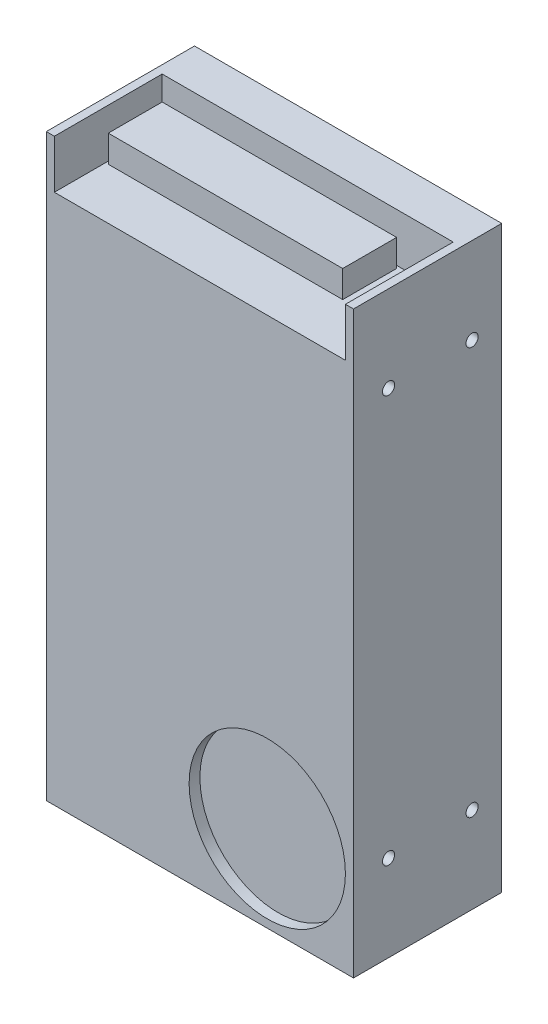
ISO-10303-21;
HEADER;
FILE_DESCRIPTION(('STEP AP214'),'2;1');
FILE_NAME('part.step','',(''),(''),'','','');
FILE_SCHEMA(('AUTOMOTIVE_DESIGN { 1 0 10303 214 1 1 1 1 }'));
ENDSEC;
DATA;
#1=APPLICATION_CONTEXT('core data for automotive mechanical design processes');
#2=APPLICATION_PROTOCOL_DEFINITION('international standard','automotive_design',2000,#1);
#3=PRODUCT_CONTEXT('',#1,'mechanical');
#4=PRODUCT('Part','Part','',(#3));
#5=PRODUCT_RELATED_PRODUCT_CATEGORY('part','',(#4));
#6=PRODUCT_DEFINITION_FORMATION('','',#4);
#7=PRODUCT_DEFINITION_CONTEXT('part definition',#1,'design');
#8=PRODUCT_DEFINITION('design','',#6,#7);
#9=PRODUCT_DEFINITION_SHAPE('','',#8);
#10=(LENGTH_UNIT() NAMED_UNIT(*) SI_UNIT(.MILLI.,.METRE.));
#11=(NAMED_UNIT(*) PLANE_ANGLE_UNIT() SI_UNIT($,.RADIAN.));
#12=(NAMED_UNIT(*) SI_UNIT($,.STERADIAN.) SOLID_ANGLE_UNIT());
#13=UNCERTAINTY_MEASURE_WITH_UNIT(LENGTH_MEASURE(1.E-05),#10,'distance_accuracy_value','');
#14=(GEOMETRIC_REPRESENTATION_CONTEXT(3) GLOBAL_UNCERTAINTY_ASSIGNED_CONTEXT((#13)) GLOBAL_UNIT_ASSIGNED_CONTEXT((#10,
#11,#12)) REPRESENTATION_CONTEXT('',''));
#15=CARTESIAN_POINT('',(0.,0.,0.));
#16=DIRECTION('',(0.,0.,1.));
#17=DIRECTION('',(1.,0.,0.));
#18=AXIS2_PLACEMENT_3D('',#15,#16,#17);
#19=CARTESIAN_POINT('',(-25.0000000000015,-75.5,15.));
#20=DIRECTION('',(0.,0.,-1.));
#21=DIRECTION('',(-1.,0.,0.));
#22=AXIS2_PLACEMENT_3D('',#19,#20,#21);
#23=CYLINDRICAL_SURFACE('',#22,2.25);
#24=CARTESIAN_POINT('',(-25.0000000000015,-75.5,0.));
#25=DIRECTION('',(0.,0.,-1.));
#26=DIRECTION('',(-1.,0.,0.));
#27=AXIS2_PLACEMENT_3D('',#24,#25,#26);
#28=CIRCLE('',#27,2.25);
#29=CARTESIAN_POINT('',(-27.2500000000015,-75.5,0.));
#30=VERTEX_POINT('',#29);
#31=EDGE_CURVE('E283',#30,#30,#28,.T.);
#32=ORIENTED_EDGE('',*,*,#31,.T.);
#33=EDGE_LOOP('',(#32));
#34=FACE_BOUND('',#33,.T.);
#35=CARTESIAN_POINT('',(-25.0000000000015,-75.5,11.0000000000016));
#36=DIRECTION('',(0.707106781186547,0.,-0.707106781186547));
#37=DIRECTION('',(-0.707106781186547,0.,-0.707106781186547));
#38=AXIS2_PLACEMENT_3D('',#35,#36,#37);
#39=ELLIPSE('',#38,3.18198051533947,2.25);
#40=CARTESIAN_POINT('',(-25.0000000000015,-73.25,11.0000000000016));
#41=VERTEX_POINT('',#40);
#42=CARTESIAN_POINT('',(-25.0000000000015,-77.75,11.0000000000016));
#43=VERTEX_POINT('',#42);
#44=EDGE_CURVE('E46',#41,#43,#39,.F.);
#45=ORIENTED_EDGE('',*,*,#44,.T.);
#46=CARTESIAN_POINT('',(-25.0000000000015,-75.5,11.0000000000016));
#47=DIRECTION('',(-0.707106781186547,0.,-0.707106781186547));
#48=DIRECTION('',(0.707106781186547,0.,-0.707106781186547));
#49=AXIS2_PLACEMENT_3D('',#46,#47,#48);
#50=ELLIPSE('',#49,3.18198051533947,2.25);
#51=EDGE_CURVE('E321',#43,#41,#50,.F.);
#52=ORIENTED_EDGE('',*,*,#51,.T.);
#53=EDGE_LOOP('',(#45,#52));
#54=FACE_BOUND('',#53,.T.);
#55=ADVANCED_FACE('F32',(#34,#54),#23,.F.);
#56=CARTESIAN_POINT('',(24.9999999999985,-75.5,15.));
#57=DIRECTION('',(0.,0.,-1.));
#58=DIRECTION('',(-1.,0.,0.));
#59=AXIS2_PLACEMENT_3D('',#56,#57,#58);
#60=CYLINDRICAL_SURFACE('',#59,2.25);
#61=CARTESIAN_POINT('',(24.9999999999985,-75.5,0.));
#62=DIRECTION('',(0.,0.,-1.));
#63=DIRECTION('',(-1.,0.,0.));
#64=AXIS2_PLACEMENT_3D('',#61,#62,#63);
#65=CIRCLE('',#64,2.25);
#66=CARTESIAN_POINT('',(22.7499999999985,-75.5,0.));
#67=VERTEX_POINT('',#66);
#68=EDGE_CURVE('E289',#67,#67,#65,.T.);
#69=ORIENTED_EDGE('',*,*,#68,.T.);
#70=EDGE_LOOP('',(#69));
#71=FACE_BOUND('',#70,.T.);
#72=CARTESIAN_POINT('',(24.9999999999985,-75.5,11.0000000000016));
#73=DIRECTION('',(0.707106781186547,0.,-0.707106781186547));
#74=DIRECTION('',(-0.707106781186547,0.,-0.707106781186547));
#75=AXIS2_PLACEMENT_3D('',#72,#73,#74);
#76=ELLIPSE('',#75,3.18198051533947,2.25);
#77=CARTESIAN_POINT('',(24.9999999999985,-73.25,11.0000000000016));
#78=VERTEX_POINT('',#77);
#79=CARTESIAN_POINT('',(24.9999999999985,-77.75,11.0000000000016));
#80=VERTEX_POINT('',#79);
#81=EDGE_CURVE('E52',#78,#80,#76,.F.);
#82=ORIENTED_EDGE('',*,*,#81,.T.);
#83=CARTESIAN_POINT('',(24.9999999999985,-75.5,11.0000000000016));
#84=DIRECTION('',(-0.707106781186547,0.,-0.707106781186547));
#85=DIRECTION('',(0.707106781186547,0.,-0.707106781186547));
#86=AXIS2_PLACEMENT_3D('',#83,#84,#85);
#87=ELLIPSE('',#86,3.18198051533947,2.25);
#88=EDGE_CURVE('E11',#80,#78,#87,.F.);
#89=ORIENTED_EDGE('',*,*,#88,.T.);
#90=EDGE_LOOP('',(#82,#89));
#91=FACE_BOUND('',#90,.T.);
#92=ADVANCED_FACE('F156',(#71,#91),#60,.F.);
#93=CARTESIAN_POINT('',(25.,75.5,15.));
#94=DIRECTION('',(0.,0.,-1.));
#95=DIRECTION('',(-1.,0.,0.));
#96=AXIS2_PLACEMENT_3D('',#93,#94,#95);
#97=CYLINDRICAL_SURFACE('',#96,2.25);
#98=CARTESIAN_POINT('',(25.,75.5,0.));
#99=DIRECTION('',(0.,0.,-1.));
#100=DIRECTION('',(-1.,0.,0.));
#101=AXIS2_PLACEMENT_3D('',#98,#99,#100);
#102=CIRCLE('',#101,2.25);
#103=CARTESIAN_POINT('',(22.75,75.5,0.));
#104=VERTEX_POINT('',#103);
#105=EDGE_CURVE('E271',#104,#104,#102,.T.);
#106=ORIENTED_EDGE('',*,*,#105,.T.);
#107=EDGE_LOOP('',(#106));
#108=FACE_BOUND('',#107,.T.);
#109=CARTESIAN_POINT('',(25.,75.5,11.));
#110=DIRECTION('',(0.707106781186547,0.,-0.707106781186547));
#111=DIRECTION('',(-0.707106781186547,0.,-0.707106781186547));
#112=AXIS2_PLACEMENT_3D('',#109,#110,#111);
#113=ELLIPSE('',#112,3.18198051533947,2.25);
#114=CARTESIAN_POINT('',(25.,77.75,11.));
#115=VERTEX_POINT('',#114);
#116=CARTESIAN_POINT('',(25.,73.25,11.));
#117=VERTEX_POINT('',#116);
#118=EDGE_CURVE('E303',#115,#117,#113,.F.);
#119=ORIENTED_EDGE('',*,*,#118,.T.);
#120=CARTESIAN_POINT('',(25.,75.5,11.));
#121=DIRECTION('',(-0.707106781186547,0.,-0.707106781186547));
#122=DIRECTION('',(0.707106781186547,0.,-0.707106781186547));
#123=AXIS2_PLACEMENT_3D('',#120,#121,#122);
#124=ELLIPSE('',#123,3.18198051533947,2.25);
#125=EDGE_CURVE('E292',#117,#115,#124,.F.);
#126=ORIENTED_EDGE('',*,*,#125,.T.);
#127=EDGE_LOOP('',(#119,#126));
#128=FACE_BOUND('',#127,.T.);
#129=ADVANCED_FACE('F362',(#108,#128),#97,.F.);
#130=CARTESIAN_POINT('',(-25.,75.5,15.));
#131=DIRECTION('',(0.,0.,-1.));
#132=DIRECTION('',(-1.,0.,0.));
#133=AXIS2_PLACEMENT_3D('',#130,#131,#132);
#134=CYLINDRICAL_SURFACE('',#133,2.25);
#135=CARTESIAN_POINT('',(-25.,75.5,0.));
#136=DIRECTION('',(0.,0.,-1.));
#137=DIRECTION('',(-1.,0.,0.));
#138=AXIS2_PLACEMENT_3D('',#135,#136,#137);
#139=CIRCLE('',#138,2.25);
#140=CARTESIAN_POINT('',(-27.25,75.5,0.));
#141=VERTEX_POINT('',#140);
#142=EDGE_CURVE('E277',#141,#141,#139,.T.);
#143=ORIENTED_EDGE('',*,*,#142,.T.);
#144=EDGE_LOOP('',(#143));
#145=FACE_BOUND('',#144,.T.);
#146=CARTESIAN_POINT('',(-25.,75.5,11.));
#147=DIRECTION('',(0.707106781186547,0.,-0.707106781186547));
#148=DIRECTION('',(-0.707106781186547,0.,-0.707106781186547));
#149=AXIS2_PLACEMENT_3D('',#146,#147,#148);
#150=ELLIPSE('',#149,3.18198051533947,2.25);
#151=CARTESIAN_POINT('',(-25.,77.75,11.));
#152=VERTEX_POINT('',#151);
#153=CARTESIAN_POINT('',(-25.,73.25,11.));
#154=VERTEX_POINT('',#153);
#155=EDGE_CURVE('E168',#152,#154,#150,.F.);
#156=ORIENTED_EDGE('',*,*,#155,.T.);
#157=CARTESIAN_POINT('',(-25.,75.5,11.));
#158=DIRECTION('',(-0.707106781186547,0.,-0.707106781186547));
#159=DIRECTION('',(0.707106781186547,0.,-0.707106781186547));
#160=AXIS2_PLACEMENT_3D('',#157,#158,#159);
#161=ELLIPSE('',#160,3.18198051533947,2.25);
#162=EDGE_CURVE('E154',#154,#152,#161,.F.);
#163=ORIENTED_EDGE('',*,*,#162,.T.);
#164=EDGE_LOOP('',(#156,#163));
#165=FACE_BOUND('',#164,.T.);
#166=ADVANCED_FACE('F467',(#145,#165),#134,.F.);
#167=CARTESIAN_POINT('',(-54.,89.5,15.));
#168=DIRECTION('',(0.,-1.,0.));
#169=DIRECTION('',(0.,0.,-1.));
#170=AXIS2_PLACEMENT_3D('',#167,#168,#169);
#171=PLANE('',#170);
#172=DIRECTION('',(1.,0.,0.));
#173=VECTOR('',#172,1.);
#174=CARTESIAN_POINT('',(-54.,89.5,55.));
#175=LINE('',#174,#173);
#176=CARTESIAN_POINT('',(-54.,89.5,55.));
#177=VERTEX_POINT('',#176);
#178=CARTESIAN_POINT('',(54.,89.5,55.));
#179=VERTEX_POINT('',#178);
#180=EDGE_CURVE('E216',#177,#179,#175,.T.);
#181=ORIENTED_EDGE('',*,*,#180,.T.);
#182=DIRECTION('',(0.,0.,1.));
#183=VECTOR('',#182,1.);
#184=CARTESIAN_POINT('',(54.,89.5,15.));
#185=LINE('',#184,#183);
#186=CARTESIAN_POINT('',(54.,89.5,15.));
#187=VERTEX_POINT('',#186);
#188=EDGE_CURVE('E206',#187,#179,#185,.T.);
#189=ORIENTED_EDGE('',*,*,#188,.F.);
#190=DIRECTION('',(1.,0.,0.));
#191=VECTOR('',#190,1.);
#192=CARTESIAN_POINT('',(-54.,89.5,15.));
#193=LINE('',#192,#191);
#194=CARTESIAN_POINT('',(-54.,89.5,15.));
#195=VERTEX_POINT('',#194);
#196=EDGE_CURVE('E227',#195,#187,#193,.T.);
#197=ORIENTED_EDGE('',*,*,#196,.F.);
#198=DIRECTION('',(0.,0.,1.));
#199=VECTOR('',#198,1.);
#200=CARTESIAN_POINT('',(-54.,89.5,15.));
#201=LINE('',#200,#199);
#202=EDGE_CURVE('E203',#195,#177,#201,.T.);
#203=ORIENTED_EDGE('',*,*,#202,.T.);
#204=EDGE_LOOP('',(#181,#189,#197,#203));
#205=FACE_BOUND('',#204,.T.);
#206=DIRECTION('',(0.,0.,1.));
#207=VECTOR('',#206,1.);
#208=CARTESIAN_POINT('',(-53.,89.5,16.));
#209=LINE('',#208,#207);
#210=CARTESIAN_POINT('',(-53.,89.5,16.));
#211=VERTEX_POINT('',#210);
#212=CARTESIAN_POINT('',(-53.,89.5,36.));
#213=VERTEX_POINT('',#212);
#214=EDGE_CURVE('E254',#211,#213,#209,.T.);
#215=ORIENTED_EDGE('',*,*,#214,.F.);
#216=DIRECTION('',(-1.,0.,0.));
#217=VECTOR('',#216,1.);
#218=CARTESIAN_POINT('',(-53.,89.5,16.));
#219=LINE('',#218,#217);
#220=CARTESIAN_POINT('',(34.,89.5,16.));
#221=VERTEX_POINT('',#220);
#222=EDGE_CURVE('E244',#221,#211,#219,.T.);
#223=ORIENTED_EDGE('',*,*,#222,.F.);
#224=DIRECTION('',(0.,0.,-1.));
#225=VECTOR('',#224,1.);
#226=CARTESIAN_POINT('',(34.,89.5,16.));
#227=LINE('',#226,#225);
#228=CARTESIAN_POINT('',(34.,89.5,36.));
#229=VERTEX_POINT('',#228);
#230=EDGE_CURVE('E248',#229,#221,#227,.T.);
#231=ORIENTED_EDGE('',*,*,#230,.F.);
#232=DIRECTION('',(1.,0.,0.));
#233=VECTOR('',#232,1.);
#234=CARTESIAN_POINT('',(-53.,89.5,36.));
#235=LINE('',#234,#233);
#236=EDGE_CURVE('E251',#213,#229,#235,.T.);
#237=ORIENTED_EDGE('',*,*,#236,.F.);
#238=EDGE_LOOP('',(#215,#223,#231,#237));
#239=FACE_BOUND('',#238,.T.);
#240=ADVANCED_FACE('F441',(#205,#239),#171,.F.);
#241=CARTESIAN_POINT('',(57.,107.5,55.));
#242=DIRECTION('',(-1.,0.,0.));
#243=DIRECTION('',(0.,-1.,0.));
#244=AXIS2_PLACEMENT_3D('',#241,#242,#243);
#245=PLANE('',#244);
#246=CARTESIAN_POINT('',(57.0000000000001,-75.4999999999999,11.0000000000016));
#247=DIRECTION('',(-1.,0.,0.));
#248=DIRECTION('',(0.,-1.,0.));
#249=AXIS2_PLACEMENT_3D('',#246,#247,#248);
#250=CIRCLE('',#249,2.25);
#251=CARTESIAN_POINT('',(57.0000000000001,-77.7499999999999,11.0000000000016));
#252=VERTEX_POINT('',#251);
#253=EDGE_CURVE('E332',#252,#252,#250,.T.);
#254=ORIENTED_EDGE('',*,*,#253,.T.);
#255=EDGE_LOOP('',(#254));
#256=FACE_BOUND('',#255,.T.);
#257=CARTESIAN_POINT('',(57.0000000000001,-75.4999999999999,42.0000000000016));
#258=DIRECTION('',(-1.,0.,0.));
#259=DIRECTION('',(0.,-1.,0.));
#260=AXIS2_PLACEMENT_3D('',#257,#258,#259);
#261=CIRCLE('',#260,2.25);
#262=CARTESIAN_POINT('',(57.0000000000001,-77.7499999999999,42.0000000000016));
#263=VERTEX_POINT('',#262);
#264=EDGE_CURVE('E315',#263,#263,#261,.T.);
#265=ORIENTED_EDGE('',*,*,#264,.T.);
#266=EDGE_LOOP('',(#265));
#267=FACE_BOUND('',#266,.T.);
#268=CARTESIAN_POINT('',(57.,75.5000000000001,42.));
#269=DIRECTION('',(-1.,0.,0.));
#270=DIRECTION('',(0.,-1.,0.));
#271=AXIS2_PLACEMENT_3D('',#268,#269,#270);
#272=CIRCLE('',#271,2.25);
#273=CARTESIAN_POINT('',(57.,73.2500000000001,42.));
#274=VERTEX_POINT('',#273);
#275=EDGE_CURVE('E309',#274,#274,#272,.T.);
#276=ORIENTED_EDGE('',*,*,#275,.T.);
#277=EDGE_LOOP('',(#276));
#278=FACE_BOUND('',#277,.T.);
#279=CARTESIAN_POINT('',(57.,75.5000000000001,11.));
#280=DIRECTION('',(-1.,0.,0.));
#281=DIRECTION('',(0.,-1.,0.));
#282=AXIS2_PLACEMENT_3D('',#279,#280,#281);
#283=CIRCLE('',#282,2.25);
#284=CARTESIAN_POINT('',(57.,73.2500000000001,11.));
#285=VERTEX_POINT('',#284);
#286=EDGE_CURVE('E305',#285,#285,#283,.T.);
#287=ORIENTED_EDGE('',*,*,#286,.T.);
#288=EDGE_LOOP('',(#287));
#289=FACE_BOUND('',#288,.T.);
#290=DIRECTION('',(0.,1.,0.));
#291=VECTOR('',#290,1.);
#292=CARTESIAN_POINT('',(57.,107.5,0.));
#293=LINE('',#292,#291);
#294=CARTESIAN_POINT('',(57.,-107.5,0.));
#295=VERTEX_POINT('',#294);
#296=CARTESIAN_POINT('',(57.,107.5,0.));
#297=VERTEX_POINT('',#296);
#298=EDGE_CURVE('E190',#295,#297,#293,.T.);
#299=ORIENTED_EDGE('',*,*,#298,.T.);
#300=DIRECTION('',(0.,0.,-1.));
#301=VECTOR('',#300,1.);
#302=CARTESIAN_POINT('',(57.,107.5,55.));
#303=LINE('',#302,#301);
#304=CARTESIAN_POINT('',(57.,107.5,55.));
#305=VERTEX_POINT('',#304);
#306=EDGE_CURVE('E170',#305,#297,#303,.T.);
#307=ORIENTED_EDGE('',*,*,#306,.F.);
#308=DIRECTION('',(0.,1.,0.));
#309=VECTOR('',#308,1.);
#310=CARTESIAN_POINT('',(57.,107.5,55.));
#311=LINE('',#310,#309);
#312=CARTESIAN_POINT('',(57.,-107.5,55.));
#313=VERTEX_POINT('',#312);
#314=EDGE_CURVE('E185',#313,#305,#311,.T.);
#315=ORIENTED_EDGE('',*,*,#314,.F.);
#316=DIRECTION('',(0.,0.,-1.));
#317=VECTOR('',#316,1.);
#318=CARTESIAN_POINT('',(57.,-107.5,55.));
#319=LINE('',#318,#317);
#320=EDGE_CURVE('E179',#313,#295,#319,.T.);
#321=ORIENTED_EDGE('',*,*,#320,.T.);
#322=EDGE_LOOP('',(#299,#307,#315,#321));
#323=FACE_BOUND('',#322,.T.);
#324=ADVANCED_FACE('F34',(#256,#267,#278,#289,#323),#245,.F.);
#325=CARTESIAN_POINT('',(-57.,107.5,55.));
#326=DIRECTION('',(0.,-1.,0.));
#327=DIRECTION('',(0.,0.,-1.));
#328=AXIS2_PLACEMENT_3D('',#325,#326,#327);
#329=PLANE('',#328);
#330=DIRECTION('',(-1.,0.,0.));
#331=VECTOR('',#330,1.);
#332=CARTESIAN_POINT('',(-57.,107.5,55.));
#333=LINE('',#332,#331);
#334=CARTESIAN_POINT('',(-54.,107.5,55.));
#335=VERTEX_POINT('',#334);
#336=CARTESIAN_POINT('',(-57.,107.5,55.));
#337=VERTEX_POINT('',#336);
#338=EDGE_CURVE('E200',#335,#337,#333,.T.);
#339=ORIENTED_EDGE('',*,*,#338,.F.);
#340=DIRECTION('',(0.,0.,1.));
#341=VECTOR('',#340,1.);
#342=CARTESIAN_POINT('',(-54.,107.5,15.));
#343=LINE('',#342,#341);
#344=CARTESIAN_POINT('',(-54.,107.5,15.));
#345=VERTEX_POINT('',#344);
#346=EDGE_CURVE('E193',#345,#335,#343,.T.);
#347=ORIENTED_EDGE('',*,*,#346,.F.);
#348=DIRECTION('',(-1.,0.,0.));
#349=VECTOR('',#348,1.);
#350=CARTESIAN_POINT('',(-54.,107.5,15.));
#351=LINE('',#350,#349);
#352=CARTESIAN_POINT('',(54.,107.5,15.));
#353=VERTEX_POINT('',#352);
#354=EDGE_CURVE('E207',#353,#345,#351,.T.);
#355=ORIENTED_EDGE('',*,*,#354,.F.);
#356=DIRECTION('',(0.,0.,1.));
#357=VECTOR('',#356,1.);
#358=CARTESIAN_POINT('',(54.,107.5,15.));
#359=LINE('',#358,#357);
#360=CARTESIAN_POINT('',(54.,107.5,55.));
#361=VERTEX_POINT('',#360);
#362=EDGE_CURVE('E209',#353,#361,#359,.T.);
#363=ORIENTED_EDGE('',*,*,#362,.T.);
#364=EDGE_CURVE('E197',#305,#361,#333,.T.);
#365=ORIENTED_EDGE('',*,*,#364,.F.);
#366=ORIENTED_EDGE('',*,*,#306,.T.);
#367=DIRECTION('',(-1.,0.,0.));
#368=VECTOR('',#367,1.);
#369=CARTESIAN_POINT('',(-57.,107.5,0.));
#370=LINE('',#369,#368);
#371=CARTESIAN_POINT('',(-57.,107.5,0.));
#372=VERTEX_POINT('',#371);
#373=EDGE_CURVE('E188',#297,#372,#370,.T.);
#374=ORIENTED_EDGE('',*,*,#373,.T.);
#375=DIRECTION('',(0.,0.,-1.));
#376=VECTOR('',#375,1.);
#377=CARTESIAN_POINT('',(-57.,107.5,55.));
#378=LINE('',#377,#376);
#379=EDGE_CURVE('E173',#337,#372,#378,.T.);
#380=ORIENTED_EDGE('',*,*,#379,.F.);
#381=EDGE_LOOP('',(#339,#347,#355,#363,#365,#366,#374,#380));
#382=FACE_BOUND('',#381,.T.);
#383=ADVANCED_FACE('F404',(#382),#329,.F.);
#384=CARTESIAN_POINT('',(-57.,107.5,55.));
#385=DIRECTION('',(1.,0.,0.));
#386=DIRECTION('',(0.,1.,0.));
#387=AXIS2_PLACEMENT_3D('',#384,#385,#386);
#388=PLANE('',#387);
#389=CARTESIAN_POINT('',(-57.,-75.5,11.0000000000016));
#390=DIRECTION('',(-1.,0.,0.));
#391=DIRECTION('',(0.,-1.,0.));
#392=AXIS2_PLACEMENT_3D('',#389,#390,#391);
#393=CIRCLE('',#392,2.25);
#394=CARTESIAN_POINT('',(-57.,-77.75,11.0000000000016));
#395=VERTEX_POINT('',#394);
#396=EDGE_CURVE('E333',#395,#395,#393,.T.);
#397=ORIENTED_EDGE('',*,*,#396,.F.);
#398=EDGE_LOOP('',(#397));
#399=FACE_BOUND('',#398,.T.);
#400=CARTESIAN_POINT('',(-57.,-75.4999999999999,42.0000000000016));
#401=DIRECTION('',(-1.,0.,0.));
#402=DIRECTION('',(0.,-1.,0.));
#403=AXIS2_PLACEMENT_3D('',#400,#401,#402);
#404=CIRCLE('',#403,2.25);
#405=CARTESIAN_POINT('',(-57.,-77.7499999999999,42.0000000000016));
#406=VERTEX_POINT('',#405);
#407=EDGE_CURVE('E318',#406,#406,#404,.T.);
#408=ORIENTED_EDGE('',*,*,#407,.F.);
#409=EDGE_LOOP('',(#408));
#410=FACE_BOUND('',#409,.T.);
#411=CARTESIAN_POINT('',(-57.,75.5,42.));
#412=DIRECTION('',(-1.,0.,0.));
#413=DIRECTION('',(0.,-1.,0.));
#414=AXIS2_PLACEMENT_3D('',#411,#412,#413);
#415=CIRCLE('',#414,2.25);
#416=CARTESIAN_POINT('',(-57.,73.25,42.));
#417=VERTEX_POINT('',#416);
#418=EDGE_CURVE('E312',#417,#417,#415,.T.);
#419=ORIENTED_EDGE('',*,*,#418,.F.);
#420=EDGE_LOOP('',(#419));
#421=FACE_BOUND('',#420,.T.);
#422=CARTESIAN_POINT('',(-57.,75.5,11.));
#423=DIRECTION('',(-1.,0.,0.));
#424=DIRECTION('',(0.,-1.,0.));
#425=AXIS2_PLACEMENT_3D('',#422,#423,#424);
#426=CIRCLE('',#425,2.25);
#427=CARTESIAN_POINT('',(-57.,73.25,11.));
#428=VERTEX_POINT('',#427);
#429=EDGE_CURVE('E306',#428,#428,#426,.T.);
#430=ORIENTED_EDGE('',*,*,#429,.F.);
#431=EDGE_LOOP('',(#430));
#432=FACE_BOUND('',#431,.T.);
#433=DIRECTION('',(0.,-1.,0.));
#434=VECTOR('',#433,1.);
#435=CARTESIAN_POINT('',(-57.,107.5,0.));
#436=LINE('',#435,#434);
#437=CARTESIAN_POINT('',(-57.,-107.5,0.));
#438=VERTEX_POINT('',#437);
#439=EDGE_CURVE('E186',#372,#438,#436,.T.);
#440=ORIENTED_EDGE('',*,*,#439,.T.);
#441=DIRECTION('',(0.,0.,-1.));
#442=VECTOR('',#441,1.);
#443=CARTESIAN_POINT('',(-57.,-107.5,55.));
#444=LINE('',#443,#442);
#445=CARTESIAN_POINT('',(-57.,-107.5,55.));
#446=VERTEX_POINT('',#445);
#447=EDGE_CURVE('E176',#446,#438,#444,.T.);
#448=ORIENTED_EDGE('',*,*,#447,.F.);
#449=DIRECTION('',(0.,-1.,0.));
#450=VECTOR('',#449,1.);
#451=CARTESIAN_POINT('',(-57.,107.5,55.));
#452=LINE('',#451,#450);
#453=EDGE_CURVE('E195',#337,#446,#452,.T.);
#454=ORIENTED_EDGE('',*,*,#453,.F.);
#455=ORIENTED_EDGE('',*,*,#379,.T.);
#456=EDGE_LOOP('',(#440,#448,#454,#455));
#457=FACE_BOUND('',#456,.T.);
#458=ADVANCED_FACE('F400',(#399,#410,#421,#432,#457),#388,.F.);
#459=CARTESIAN_POINT('',(-57.,-107.5,55.));
#460=DIRECTION('',(0.,1.,0.));
#461=DIRECTION('',(0.,0.,1.));
#462=AXIS2_PLACEMENT_3D('',#459,#460,#461);
#463=PLANE('',#462);
#464=DIRECTION('',(1.,0.,0.));
#465=VECTOR('',#464,1.);
#466=CARTESIAN_POINT('',(-57.,-107.5,0.));
#467=LINE('',#466,#465);
#468=EDGE_CURVE('E183',#438,#295,#467,.T.);
#469=ORIENTED_EDGE('',*,*,#468,.T.);
#470=ORIENTED_EDGE('',*,*,#320,.F.);
#471=DIRECTION('',(1.,0.,0.));
#472=VECTOR('',#471,1.);
#473=CARTESIAN_POINT('',(-57.,-107.5,55.));
#474=LINE('',#473,#472);
#475=EDGE_CURVE('E182',#446,#313,#474,.T.);
#476=ORIENTED_EDGE('',*,*,#475,.F.);
#477=ORIENTED_EDGE('',*,*,#447,.T.);
#478=EDGE_LOOP('',(#469,#470,#476,#477));
#479=FACE_BOUND('',#478,.T.);
#480=ADVANCED_FACE('F403',(#479),#463,.F.);
#481=CARTESIAN_POINT('',(0.,0.,55.));
#482=DIRECTION('',(0.,0.,1.));
#483=DIRECTION('',(1.,0.,0.));
#484=AXIS2_PLACEMENT_3D('',#481,#482,#483);
#485=PLANE('',#484);
#486=CARTESIAN_POINT('',(25.,-75.5,55.));
#487=DIRECTION('',(0.,0.,1.));
#488=DIRECTION('',(1.,0.,0.));
#489=AXIS2_PLACEMENT_3D('',#486,#487,#488);
#490=CIRCLE('',#489,29.);
#491=CARTESIAN_POINT('',(54.,-75.5,55.));
#492=VERTEX_POINT('',#491);
#493=EDGE_CURVE('E265',#492,#492,#490,.T.);
#494=ORIENTED_EDGE('',*,*,#493,.F.);
#495=EDGE_LOOP('',(#494));
#496=FACE_BOUND('',#495,.T.);
#497=DIRECTION('',(0.,-1.,0.));
#498=VECTOR('',#497,1.);
#499=CARTESIAN_POINT('',(-54.,107.5,55.));
#500=LINE('',#499,#498);
#501=EDGE_CURVE('E219',#335,#177,#500,.T.);
#502=ORIENTED_EDGE('',*,*,#501,.F.);
#503=ORIENTED_EDGE('',*,*,#338,.T.);
#504=ORIENTED_EDGE('',*,*,#453,.T.);
#505=ORIENTED_EDGE('',*,*,#475,.T.);
#506=ORIENTED_EDGE('',*,*,#314,.T.);
#507=ORIENTED_EDGE('',*,*,#364,.T.);
#508=DIRECTION('',(0.,1.,0.));
#509=VECTOR('',#508,1.);
#510=CARTESIAN_POINT('',(54.,107.5,55.));
#511=LINE('',#510,#509);
#512=EDGE_CURVE('E213',#179,#361,#511,.T.);
#513=ORIENTED_EDGE('',*,*,#512,.F.);
#514=ORIENTED_EDGE('',*,*,#180,.F.);
#515=EDGE_LOOP('',(#502,#503,#504,#505,#506,#507,#513,#514));
#516=FACE_BOUND('',#515,.T.);
#517=ADVANCED_FACE('F427',(#496,#516),#485,.T.);
#518=CARTESIAN_POINT('',(0.,0.,0.));
#519=DIRECTION('',(0.,0.,1.));
#520=DIRECTION('',(1.,0.,0.));
#521=AXIS2_PLACEMENT_3D('',#518,#519,#520);
#522=PLANE('',#521);
#523=ORIENTED_EDGE('',*,*,#68,.F.);
#524=EDGE_LOOP('',(#523));
#525=FACE_BOUND('',#524,.T.);
#526=ORIENTED_EDGE('',*,*,#31,.F.);
#527=EDGE_LOOP('',(#526));
#528=FACE_BOUND('',#527,.T.);
#529=ORIENTED_EDGE('',*,*,#142,.F.);
#530=EDGE_LOOP('',(#529));
#531=FACE_BOUND('',#530,.T.);
#532=ORIENTED_EDGE('',*,*,#105,.F.);
#533=EDGE_LOOP('',(#532));
#534=FACE_BOUND('',#533,.T.);
#535=ORIENTED_EDGE('',*,*,#298,.F.);
#536=ORIENTED_EDGE('',*,*,#468,.F.);
#537=ORIENTED_EDGE('',*,*,#439,.F.);
#538=ORIENTED_EDGE('',*,*,#373,.F.);
#539=EDGE_LOOP('',(#535,#536,#537,#538));
#540=FACE_BOUND('',#539,.T.);
#541=ADVANCED_FACE('F421',(#525,#528,#531,#534,#540),#522,.F.);
#542=CARTESIAN_POINT('',(-54.,107.5,15.));
#543=DIRECTION('',(-1.,0.,0.));
#544=DIRECTION('',(0.,0.,1.));
#545=AXIS2_PLACEMENT_3D('',#542,#543,#544);
#546=PLANE('',#545);
#547=ORIENTED_EDGE('',*,*,#501,.T.);
#548=ORIENTED_EDGE('',*,*,#202,.F.);
#549=DIRECTION('',(0.,-1.,0.));
#550=VECTOR('',#549,1.);
#551=CARTESIAN_POINT('',(-54.,107.5,15.));
#552=LINE('',#551,#550);
#553=EDGE_CURVE('E215',#345,#195,#552,.T.);
#554=ORIENTED_EDGE('',*,*,#553,.F.);
#555=ORIENTED_EDGE('',*,*,#346,.T.);
#556=EDGE_LOOP('',(#547,#548,#554,#555));
#557=FACE_BOUND('',#556,.T.);
#558=ADVANCED_FACE('F444',(#557),#546,.F.);
#559=CARTESIAN_POINT('',(54.,107.5,15.));
#560=DIRECTION('',(1.,0.,0.));
#561=DIRECTION('',(0.,0.,-1.));
#562=AXIS2_PLACEMENT_3D('',#559,#560,#561);
#563=PLANE('',#562);
#564=ORIENTED_EDGE('',*,*,#512,.T.);
#565=ORIENTED_EDGE('',*,*,#362,.F.);
#566=DIRECTION('',(0.,1.,0.));
#567=VECTOR('',#566,1.);
#568=CARTESIAN_POINT('',(54.,107.5,15.));
#569=LINE('',#568,#567);
#570=EDGE_CURVE('E224',#187,#353,#569,.T.);
#571=ORIENTED_EDGE('',*,*,#570,.F.);
#572=ORIENTED_EDGE('',*,*,#188,.T.);
#573=EDGE_LOOP('',(#564,#565,#571,#572));
#574=FACE_BOUND('',#573,.T.);
#575=ADVANCED_FACE('F436',(#574),#563,.F.);
#576=CARTESIAN_POINT('',(0.,0.,15.));
#577=DIRECTION('',(0.,0.,1.));
#578=DIRECTION('',(1.,0.,0.));
#579=AXIS2_PLACEMENT_3D('',#576,#577,#578);
#580=PLANE('',#579);
#581=ORIENTED_EDGE('',*,*,#553,.T.);
#582=ORIENTED_EDGE('',*,*,#196,.T.);
#583=ORIENTED_EDGE('',*,*,#570,.T.);
#584=ORIENTED_EDGE('',*,*,#354,.T.);
#585=EDGE_LOOP('',(#581,#582,#583,#584));
#586=FACE_BOUND('',#585,.T.);
#587=ADVANCED_FACE('F438',(#586),#580,.T.);
#588=CARTESIAN_POINT('',(-53.,99.5,16.));
#589=DIRECTION('',(1.,0.,0.));
#590=DIRECTION('',(0.,0.,-1.));
#591=AXIS2_PLACEMENT_3D('',#588,#589,#590);
#592=PLANE('',#591);
#593=ORIENTED_EDGE('',*,*,#214,.T.);
#594=DIRECTION('',(0.,-1.,0.));
#595=VECTOR('',#594,1.);
#596=CARTESIAN_POINT('',(-53.,99.5,36.));
#597=LINE('',#596,#595);
#598=CARTESIAN_POINT('',(-53.,99.5,36.));
#599=VERTEX_POINT('',#598);
#600=EDGE_CURVE('E221',#599,#213,#597,.T.);
#601=ORIENTED_EDGE('',*,*,#600,.F.);
#602=DIRECTION('',(0.,0.,1.));
#603=VECTOR('',#602,1.);
#604=CARTESIAN_POINT('',(-53.,99.5,16.));
#605=LINE('',#604,#603);
#606=CARTESIAN_POINT('',(-53.,99.5,16.));
#607=VERTEX_POINT('',#606);
#608=EDGE_CURVE('E247',#607,#599,#605,.T.);
#609=ORIENTED_EDGE('',*,*,#608,.F.);
#610=DIRECTION('',(0.,-1.,0.));
#611=VECTOR('',#610,1.);
#612=CARTESIAN_POINT('',(-53.,99.5,16.));
#613=LINE('',#612,#611);
#614=EDGE_CURVE('E240',#607,#211,#613,.T.);
#615=ORIENTED_EDGE('',*,*,#614,.T.);
#616=EDGE_LOOP('',(#593,#601,#609,#615));
#617=FACE_BOUND('',#616,.T.);
#618=ADVANCED_FACE('F528',(#617),#592,.F.);
#619=CARTESIAN_POINT('',(-53.,99.5,36.));
#620=DIRECTION('',(0.,0.,-1.));
#621=DIRECTION('',(-1.,0.,0.));
#622=AXIS2_PLACEMENT_3D('',#619,#620,#621);
#623=PLANE('',#622);
#624=ORIENTED_EDGE('',*,*,#236,.T.);
#625=DIRECTION('',(0.,-1.,0.));
#626=VECTOR('',#625,1.);
#627=CARTESIAN_POINT('',(34.,99.5,36.));
#628=LINE('',#627,#626);
#629=CARTESIAN_POINT('',(34.,99.5,36.));
#630=VERTEX_POINT('',#629);
#631=EDGE_CURVE('E234',#630,#229,#628,.T.);
#632=ORIENTED_EDGE('',*,*,#631,.F.);
#633=DIRECTION('',(1.,0.,0.));
#634=VECTOR('',#633,1.);
#635=CARTESIAN_POINT('',(-53.,99.5,36.));
#636=LINE('',#635,#634);
#637=EDGE_CURVE('E261',#599,#630,#636,.T.);
#638=ORIENTED_EDGE('',*,*,#637,.F.);
#639=ORIENTED_EDGE('',*,*,#600,.T.);
#640=EDGE_LOOP('',(#624,#632,#638,#639));
#641=FACE_BOUND('',#640,.T.);
#642=ADVANCED_FACE('F524',(#641),#623,.F.);
#643=CARTESIAN_POINT('',(34.,99.5,16.));
#644=DIRECTION('',(-1.,0.,0.));
#645=DIRECTION('',(0.,0.,1.));
#646=AXIS2_PLACEMENT_3D('',#643,#644,#645);
#647=PLANE('',#646);
#648=ORIENTED_EDGE('',*,*,#230,.T.);
#649=DIRECTION('',(0.,-1.,0.));
#650=VECTOR('',#649,1.);
#651=CARTESIAN_POINT('',(34.,99.5,16.));
#652=LINE('',#651,#650);
#653=CARTESIAN_POINT('',(34.,99.5,16.));
#654=VERTEX_POINT('',#653);
#655=EDGE_CURVE('E237',#654,#221,#652,.T.);
#656=ORIENTED_EDGE('',*,*,#655,.F.);
#657=DIRECTION('',(0.,0.,-1.));
#658=VECTOR('',#657,1.);
#659=CARTESIAN_POINT('',(34.,99.5,16.));
#660=LINE('',#659,#658);
#661=EDGE_CURVE('E259',#630,#654,#660,.T.);
#662=ORIENTED_EDGE('',*,*,#661,.F.);
#663=ORIENTED_EDGE('',*,*,#631,.T.);
#664=EDGE_LOOP('',(#648,#656,#662,#663));
#665=FACE_BOUND('',#664,.T.);
#666=ADVANCED_FACE('F520',(#665),#647,.F.);
#667=CARTESIAN_POINT('',(-53.,99.5,16.));
#668=DIRECTION('',(0.,0.,1.));
#669=DIRECTION('',(1.,0.,0.));
#670=AXIS2_PLACEMENT_3D('',#667,#668,#669);
#671=PLANE('',#670);
#672=ORIENTED_EDGE('',*,*,#222,.T.);
#673=ORIENTED_EDGE('',*,*,#614,.F.);
#674=DIRECTION('',(-1.,0.,0.));
#675=VECTOR('',#674,1.);
#676=CARTESIAN_POINT('',(-53.,99.5,16.));
#677=LINE('',#676,#675);
#678=EDGE_CURVE('E243',#654,#607,#677,.T.);
#679=ORIENTED_EDGE('',*,*,#678,.F.);
#680=ORIENTED_EDGE('',*,*,#655,.T.);
#681=EDGE_LOOP('',(#672,#673,#679,#680));
#682=FACE_BOUND('',#681,.T.);
#683=ADVANCED_FACE('F516',(#682),#671,.F.);
#684=CARTESIAN_POINT('',(0.,99.5,0.));
#685=DIRECTION('',(0.,1.,0.));
#686=DIRECTION('',(0.,0.,1.));
#687=AXIS2_PLACEMENT_3D('',#684,#685,#686);
#688=PLANE('',#687);
#689=ORIENTED_EDGE('',*,*,#608,.T.);
#690=ORIENTED_EDGE('',*,*,#637,.T.);
#691=ORIENTED_EDGE('',*,*,#661,.T.);
#692=ORIENTED_EDGE('',*,*,#678,.T.);
#693=EDGE_LOOP('',(#689,#690,#691,#692));
#694=FACE_BOUND('',#693,.T.);
#695=ADVANCED_FACE('F510',(#694),#688,.T.);
#696=CARTESIAN_POINT('',(25.,-75.5,51.));
#697=DIRECTION('',(0.,0.,1.));
#698=DIRECTION('',(1.,0.,0.));
#699=AXIS2_PLACEMENT_3D('',#696,#697,#698);
#700=CYLINDRICAL_SURFACE('',#699,29.);
#701=CARTESIAN_POINT('',(25.,-75.5,51.));
#702=DIRECTION('',(0.,0.,1.));
#703=DIRECTION('',(1.,0.,0.));
#704=AXIS2_PLACEMENT_3D('',#701,#702,#703);
#705=CIRCLE('',#704,29.);
#706=CARTESIAN_POINT('',(54.,-75.5,51.));
#707=VERTEX_POINT('',#706);
#708=EDGE_CURVE('E257',#707,#707,#705,.T.);
#709=ORIENTED_EDGE('',*,*,#708,.F.);
#710=EDGE_LOOP('',(#709));
#711=FACE_BOUND('',#710,.T.);
#712=ORIENTED_EDGE('',*,*,#493,.T.);
#713=EDGE_LOOP('',(#712));
#714=FACE_BOUND('',#713,.T.);
#715=ADVANCED_FACE('F504',(#711,#714),#700,.F.);
#716=CARTESIAN_POINT('',(25.,-75.5,51.));
#717=DIRECTION('',(0.,0.,1.));
#718=DIRECTION('',(1.,0.,0.));
#719=AXIS2_PLACEMENT_3D('',#716,#717,#718);
#720=PLANE('',#719);
#721=ORIENTED_EDGE('',*,*,#708,.T.);
#722=EDGE_LOOP('',(#721));
#723=FACE_BOUND('',#722,.T.);
#724=ADVANCED_FACE('F499',(#723),#720,.T.);
#725=CARTESIAN_POINT('',(57.,75.5000000000001,11.));
#726=DIRECTION('',(-1.,0.,0.));
#727=DIRECTION('',(0.,-1.,0.));
#728=AXIS2_PLACEMENT_3D('',#725,#726,#727);
#729=CYLINDRICAL_SURFACE('',#728,2.25);
#730=ORIENTED_EDGE('',*,*,#429,.T.);
#731=EDGE_LOOP('',(#730));
#732=FACE_BOUND('',#731,.T.);
#733=ORIENTED_EDGE('',*,*,#155,.F.);
#734=CARTESIAN_POINT('',(-25.,75.5,11.));
#735=DIRECTION('',(-0.707106781186547,0.,-0.707106781186547));
#736=DIRECTION('',(0.707106781186547,0.,-0.707106781186547));
#737=AXIS2_PLACEMENT_3D('',#734,#735,#736);
#738=ELLIPSE('',#737,3.18198051533947,2.25);
#739=EDGE_CURVE('E162',#154,#152,#738,.T.);
#740=ORIENTED_EDGE('',*,*,#739,.F.);
#741=EDGE_LOOP('',(#733,#740));
#742=FACE_BOUND('',#741,.T.);
#743=ADVANCED_FACE('F389',(#732,#742),#729,.F.);
#744=CARTESIAN_POINT('',(-25.,75.5,15.));
#745=DIRECTION('',(0.,0.,-1.));
#746=DIRECTION('',(-1.,0.,0.));
#747=AXIS2_PLACEMENT_3D('',#744,#745,#746);
#748=PLANE('',#747);
#749=CARTESIAN_POINT('',(-25.,75.5,15.));
#750=DIRECTION('',(0.,0.,-1.));
#751=DIRECTION('',(-1.,0.,0.));
#752=AXIS2_PLACEMENT_3D('',#749,#750,#751);
#753=CIRCLE('',#752,2.25);
#754=CARTESIAN_POINT('',(-27.25,75.5,15.));
#755=VERTEX_POINT('',#754);
#756=EDGE_CURVE('E274',#755,#755,#753,.T.);
#757=ORIENTED_EDGE('',*,*,#756,.T.);
#758=EDGE_LOOP('',(#757));
#759=FACE_BOUND('',#758,.T.);
#760=ADVANCED_FACE('F482',(#759),#748,.T.);
#761=CARTESIAN_POINT('',(-25.,75.5,11.));
#762=DIRECTION('',(0.707106781186547,0.,-0.707106781186547));
#763=DIRECTION('',(-0.707106781186547,0.,-0.707106781186547));
#764=AXIS2_PLACEMENT_3D('',#761,#762,#763);
#765=ELLIPSE('',#764,3.18198051533947,2.25);
#766=EDGE_CURVE('E165',#152,#154,#765,.T.);
#767=ORIENTED_EDGE('',*,*,#766,.T.);
#768=ORIENTED_EDGE('',*,*,#739,.T.);
#769=EDGE_LOOP('',(#767,#768));
#770=FACE_BOUND('',#769,.T.);
#771=ORIENTED_EDGE('',*,*,#756,.F.);
#772=EDGE_LOOP('',(#771));
#773=FACE_BOUND('',#772,.T.);
#774=ADVANCED_FACE('F473',(#770,#773),#134,.F.);
#775=ORIENTED_EDGE('',*,*,#766,.F.);
#776=ORIENTED_EDGE('',*,*,#162,.F.);
#777=EDGE_LOOP('',(#775,#776));
#778=FACE_BOUND('',#777,.T.);
#779=ORIENTED_EDGE('',*,*,#118,.F.);
#780=CARTESIAN_POINT('',(25.,75.5,11.));
#781=DIRECTION('',(-0.707106781186547,0.,-0.707106781186547));
#782=DIRECTION('',(0.707106781186547,0.,-0.707106781186547));
#783=AXIS2_PLACEMENT_3D('',#780,#781,#782);
#784=ELLIPSE('',#783,3.18198051533947,2.25);
#785=EDGE_CURVE('E297',#117,#115,#784,.T.);
#786=ORIENTED_EDGE('',*,*,#785,.F.);
#787=EDGE_LOOP('',(#779,#786));
#788=FACE_BOUND('',#787,.T.);
#789=ADVANCED_FACE('F388',(#778,#788),#729,.F.);
#790=CARTESIAN_POINT('',(25.,75.5,15.));
#791=DIRECTION('',(0.,0.,-1.));
#792=DIRECTION('',(-1.,0.,0.));
#793=AXIS2_PLACEMENT_3D('',#790,#791,#792);
#794=PLANE('',#793);
#795=CARTESIAN_POINT('',(25.,75.5,15.));
#796=DIRECTION('',(0.,0.,-1.));
#797=DIRECTION('',(-1.,0.,0.));
#798=AXIS2_PLACEMENT_3D('',#795,#796,#797);
#799=CIRCLE('',#798,2.25);
#800=CARTESIAN_POINT('',(22.75,75.5,15.));
#801=VERTEX_POINT('',#800);
#802=EDGE_CURVE('E268',#801,#801,#799,.T.);
#803=ORIENTED_EDGE('',*,*,#802,.T.);
#804=EDGE_LOOP('',(#803));
#805=FACE_BOUND('',#804,.T.);
#806=ADVANCED_FACE('F488',(#805),#794,.T.);
#807=CARTESIAN_POINT('',(25.,75.5,11.));
#808=DIRECTION('',(0.707106781186547,0.,-0.707106781186547));
#809=DIRECTION('',(-0.707106781186547,0.,-0.707106781186547));
#810=AXIS2_PLACEMENT_3D('',#807,#808,#809);
#811=ELLIPSE('',#810,3.18198051533947,2.25);
#812=EDGE_CURVE('E300',#115,#117,#811,.T.);
#813=ORIENTED_EDGE('',*,*,#812,.T.);
#814=ORIENTED_EDGE('',*,*,#785,.T.);
#815=EDGE_LOOP('',(#813,#814));
#816=FACE_BOUND('',#815,.T.);
#817=ORIENTED_EDGE('',*,*,#802,.F.);
#818=EDGE_LOOP('',(#817));
#819=FACE_BOUND('',#818,.T.);
#820=ADVANCED_FACE('F386',(#816,#819),#97,.F.);
#821=ORIENTED_EDGE('',*,*,#286,.F.);
#822=EDGE_LOOP('',(#821));
#823=FACE_BOUND('',#822,.T.);
#824=ORIENTED_EDGE('',*,*,#812,.F.);
#825=ORIENTED_EDGE('',*,*,#125,.F.);
#826=EDGE_LOOP('',(#824,#825));
#827=FACE_BOUND('',#826,.T.);
#828=ADVANCED_FACE('F382',(#823,#827),#729,.F.);
#829=CARTESIAN_POINT('',(57.,75.5000000000001,42.));
#830=DIRECTION('',(-1.,0.,0.));
#831=DIRECTION('',(0.,-1.,0.));
#832=AXIS2_PLACEMENT_3D('',#829,#830,#831);
#833=CYLINDRICAL_SURFACE('',#832,2.25);
#834=ORIENTED_EDGE('',*,*,#275,.F.);
#835=EDGE_LOOP('',(#834));
#836=FACE_BOUND('',#835,.T.);
#837=ORIENTED_EDGE('',*,*,#418,.T.);
#838=EDGE_LOOP('',(#837));
#839=FACE_BOUND('',#838,.T.);
#840=ADVANCED_FACE('F385',(#836,#839),#833,.F.);
#841=CARTESIAN_POINT('',(57.0000000000001,-75.4999999999999,42.0000000000016));
#842=DIRECTION('',(-1.,0.,0.));
#843=DIRECTION('',(0.,-1.,0.));
#844=AXIS2_PLACEMENT_3D('',#841,#842,#843);
#845=CYLINDRICAL_SURFACE('',#844,2.25);
#846=ORIENTED_EDGE('',*,*,#264,.F.);
#847=EDGE_LOOP('',(#846));
#848=FACE_BOUND('',#847,.T.);
#849=ORIENTED_EDGE('',*,*,#407,.T.);
#850=EDGE_LOOP('',(#849));
#851=FACE_BOUND('',#850,.T.);
#852=ADVANCED_FACE('F354',(#848,#851),#845,.F.);
#853=CARTESIAN_POINT('',(57.0000000000001,-75.4999999999999,11.0000000000016));
#854=DIRECTION('',(-1.,0.,0.));
#855=DIRECTION('',(0.,-1.,0.));
#856=AXIS2_PLACEMENT_3D('',#853,#854,#855);
#857=CYLINDRICAL_SURFACE('',#856,2.25);
#858=ORIENTED_EDGE('',*,*,#81,.F.);
#859=CARTESIAN_POINT('',(24.9999999999985,-75.5,11.0000000000016));
#860=DIRECTION('',(-0.707106781186547,0.,-0.707106781186547));
#861=DIRECTION('',(0.707106781186547,0.,-0.707106781186547));
#862=AXIS2_PLACEMENT_3D('',#859,#860,#861);
#863=ELLIPSE('',#862,3.18198051533947,2.25);
#864=EDGE_CURVE('E40',#80,#78,#863,.T.);
#865=ORIENTED_EDGE('',*,*,#864,.F.);
#866=EDGE_LOOP('',(#858,#865));
#867=FACE_BOUND('',#866,.T.);
#868=CARTESIAN_POINT('',(-25.0000000000015,-75.5,11.0000000000016));
#869=DIRECTION('',(0.707106781186547,0.,-0.707106781186547));
#870=DIRECTION('',(-0.707106781186547,0.,-0.707106781186547));
#871=AXIS2_PLACEMENT_3D('',#868,#869,#870);
#872=ELLIPSE('',#871,3.18198051533947,2.25);
#873=EDGE_CURVE('E328',#41,#43,#872,.T.);
#874=ORIENTED_EDGE('',*,*,#873,.F.);
#875=ORIENTED_EDGE('',*,*,#51,.F.);
#876=EDGE_LOOP('',(#874,#875));
#877=FACE_BOUND('',#876,.T.);
#878=ADVANCED_FACE('F152',(#867,#877),#857,.F.);
#879=CARTESIAN_POINT('',(24.9999999999985,-75.5,15.));
#880=DIRECTION('',(0.,0.,-1.));
#881=DIRECTION('',(-1.,0.,0.));
#882=AXIS2_PLACEMENT_3D('',#879,#880,#881);
#883=PLANE('',#882);
#884=CARTESIAN_POINT('',(24.9999999999985,-75.5,15.));
#885=DIRECTION('',(0.,0.,-1.));
#886=DIRECTION('',(-1.,0.,0.));
#887=AXIS2_PLACEMENT_3D('',#884,#885,#886);
#888=CIRCLE('',#887,2.25);
#889=CARTESIAN_POINT('',(22.7499999999985,-75.5,15.));
#890=VERTEX_POINT('',#889);
#891=EDGE_CURVE('E286',#890,#890,#888,.T.);
#892=ORIENTED_EDGE('',*,*,#891,.T.);
#893=EDGE_LOOP('',(#892));
#894=FACE_BOUND('',#893,.T.);
#895=ADVANCED_FACE('F350',(#894),#883,.T.);
#896=CARTESIAN_POINT('',(24.9999999999985,-75.5,11.0000000000016));
#897=DIRECTION('',(0.707106781186547,0.,-0.707106781186547));
#898=DIRECTION('',(-0.707106781186547,0.,-0.707106781186547));
#899=AXIS2_PLACEMENT_3D('',#896,#897,#898);
#900=ELLIPSE('',#899,3.18198051533947,2.25);
#901=EDGE_CURVE('E146',#78,#80,#900,.T.);
#902=ORIENTED_EDGE('',*,*,#901,.T.);
#903=ORIENTED_EDGE('',*,*,#864,.T.);
#904=EDGE_LOOP('',(#902,#903));
#905=FACE_BOUND('',#904,.T.);
#906=ORIENTED_EDGE('',*,*,#891,.F.);
#907=EDGE_LOOP('',(#906));
#908=FACE_BOUND('',#907,.T.);
#909=ADVANCED_FACE('F157',(#905,#908),#60,.F.);
#910=ORIENTED_EDGE('',*,*,#253,.F.);
#911=EDGE_LOOP('',(#910));
#912=FACE_BOUND('',#911,.T.);
#913=ORIENTED_EDGE('',*,*,#901,.F.);
#914=ORIENTED_EDGE('',*,*,#88,.F.);
#915=EDGE_LOOP('',(#913,#914));
#916=FACE_BOUND('',#915,.T.);
#917=ADVANCED_FACE('F147',(#912,#916),#857,.F.);
#918=ORIENTED_EDGE('',*,*,#396,.T.);
#919=EDGE_LOOP('',(#918));
#920=FACE_BOUND('',#919,.T.);
#921=ORIENTED_EDGE('',*,*,#44,.F.);
#922=CARTESIAN_POINT('',(-25.0000000000015,-75.5,11.0000000000016));
#923=DIRECTION('',(-0.707106781186547,0.,-0.707106781186547));
#924=DIRECTION('',(0.707106781186547,0.,-0.707106781186547));
#925=AXIS2_PLACEMENT_3D('',#922,#923,#924);
#926=ELLIPSE('',#925,3.18198051533947,2.25);
#927=EDGE_CURVE('E325',#43,#41,#926,.T.);
#928=ORIENTED_EDGE('',*,*,#927,.F.);
#929=EDGE_LOOP('',(#921,#928));
#930=FACE_BOUND('',#929,.T.);
#931=ADVANCED_FACE('F342',(#920,#930),#857,.F.);
#932=CARTESIAN_POINT('',(-25.0000000000015,-75.5,15.));
#933=DIRECTION('',(0.,0.,-1.));
#934=DIRECTION('',(-1.,0.,0.));
#935=AXIS2_PLACEMENT_3D('',#932,#933,#934);
#936=PLANE('',#935);
#937=CARTESIAN_POINT('',(-25.0000000000015,-75.5,15.));
#938=DIRECTION('',(0.,0.,-1.));
#939=DIRECTION('',(-1.,0.,0.));
#940=AXIS2_PLACEMENT_3D('',#937,#938,#939);
#941=CIRCLE('',#940,2.25);
#942=CARTESIAN_POINT('',(-27.2500000000015,-75.5,15.));
#943=VERTEX_POINT('',#942);
#944=EDGE_CURVE('E280',#943,#943,#941,.T.);
#945=ORIENTED_EDGE('',*,*,#944,.T.);
#946=EDGE_LOOP('',(#945));
#947=FACE_BOUND('',#946,.T.);
#948=ADVANCED_FACE('F348',(#947),#936,.T.);
#949=ORIENTED_EDGE('',*,*,#873,.T.);
#950=ORIENTED_EDGE('',*,*,#927,.T.);
#951=EDGE_LOOP('',(#949,#950));
#952=FACE_BOUND('',#951,.T.);
#953=ORIENTED_EDGE('',*,*,#944,.F.);
#954=EDGE_LOOP('',(#953));
#955=FACE_BOUND('',#954,.T.);
#956=ADVANCED_FACE('F358',(#952,#955),#23,.F.);
#957=CLOSED_SHELL('',(#55,#92,#129,#166,#240,#324,#383,#458,#480,#517,#541,#558,#575,#587,#618,
#642,#666,#683,#695,#715,#724,#743,#760,#774,#789,#806,#820,#828,#840,#852,#878,#895,#909,#917,
#931,#948,#956));
#958=MANIFOLD_SOLID_BREP('B2',#957);
#959=ADVANCED_BREP_SHAPE_REPRESENTATION('',(#18,#958),#14);
#960=SHAPE_DEFINITION_REPRESENTATION(#9,#959);
ENDSEC;
END-ISO-10303-21;
